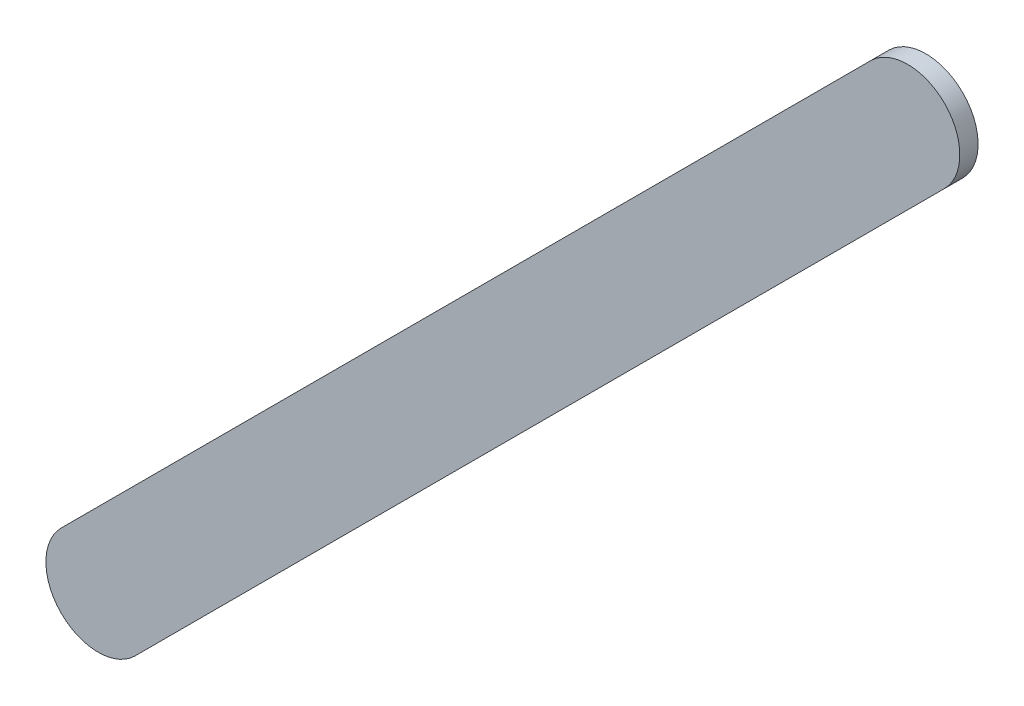
ISO-10303-21;
HEADER;
FILE_DESCRIPTION(('STEP AP214'),'2;1');
FILE_NAME('part.step','',(''),(''),'','','');
FILE_SCHEMA(('AUTOMOTIVE_DESIGN { 1 0 10303 214 1 1 1 1 }'));
ENDSEC;
DATA;
#1=APPLICATION_CONTEXT('core data for automotive mechanical design processes');
#2=APPLICATION_PROTOCOL_DEFINITION('international standard','automotive_design',2000,#1);
#3=PRODUCT_CONTEXT('',#1,'mechanical');
#4=PRODUCT('Part','Part','',(#3));
#5=PRODUCT_RELATED_PRODUCT_CATEGORY('part','',(#4));
#6=PRODUCT_DEFINITION_FORMATION('','',#4);
#7=PRODUCT_DEFINITION_CONTEXT('part definition',#1,'design');
#8=PRODUCT_DEFINITION('design','',#6,#7);
#9=PRODUCT_DEFINITION_SHAPE('','',#8);
#10=(LENGTH_UNIT() NAMED_UNIT(*) SI_UNIT(.MILLI.,.METRE.));
#11=(NAMED_UNIT(*) PLANE_ANGLE_UNIT() SI_UNIT($,.RADIAN.));
#12=(NAMED_UNIT(*) SI_UNIT($,.STERADIAN.) SOLID_ANGLE_UNIT());
#13=UNCERTAINTY_MEASURE_WITH_UNIT(LENGTH_MEASURE(1.E-05),#10,'distance_accuracy_value','');
#14=(GEOMETRIC_REPRESENTATION_CONTEXT(3) GLOBAL_UNCERTAINTY_ASSIGNED_CONTEXT((#13)) GLOBAL_UNIT_ASSIGNED_CONTEXT((#10,
#11,#12)) REPRESENTATION_CONTEXT('',''));
#15=CARTESIAN_POINT('',(0.,0.,0.));
#16=DIRECTION('',(0.,0.,1.));
#17=DIRECTION('',(1.,0.,0.));
#18=AXIS2_PLACEMENT_3D('',#15,#16,#17);
#19=CARTESIAN_POINT('',(91.67071,-133.055024,1.635));
#20=DIRECTION('',(0.,0.,1.));
#21=DIRECTION('',(1.,0.,0.));
#22=AXIS2_PLACEMENT_3D('',#19,#20,#21);
#23=PLANE('',#22);
#24=DIRECTION('',(0.707106781186548,0.707106781186548,0.));
#25=VECTOR('',#24,1.);
#26=CARTESIAN_POINT('',(91.67071,-133.055024,1.635));
#27=LINE('',#26,#25);
#28=CARTESIAN_POINT('',(91.67071,-133.055024,1.635));
#29=VERTEX_POINT('',#28);
#30=CARTESIAN_POINT('',(93.22071,-131.505024,1.635));
#31=VERTEX_POINT('',#30);
#32=EDGE_CURVE('E97',#29,#31,#27,.T.);
#33=ORIENTED_EDGE('',*,*,#32,.T.);
#34=CARTESIAN_POINT('',(93.1499995,-131.4343135,1.635));
#35=DIRECTION('',(0.,0.,1.));
#36=DIRECTION('',(0.707106781186548,-0.707106781186548,0.));
#37=AXIS2_PLACEMENT_3D('',#34,#35,#36);
#38=CIRCLE('',#37,0.09999974810217);
#39=CARTESIAN_POINT('',(93.079289,-131.363603,1.635));
#40=VERTEX_POINT('',#39);
#41=EDGE_CURVE('E76',#31,#40,#38,.T.);
#42=ORIENTED_EDGE('',*,*,#41,.T.);
#43=DIRECTION('',(-0.707106781186548,-0.707106781186548,0.));
#44=VECTOR('',#43,1.);
#45=CARTESIAN_POINT('',(93.079289,-131.363603,1.635));
#46=LINE('',#45,#44);
#47=CARTESIAN_POINT('',(91.529289,-132.913603,1.635));
#48=VERTEX_POINT('',#47);
#49=EDGE_CURVE('E81',#40,#48,#46,.T.);
#50=ORIENTED_EDGE('',*,*,#49,.T.);
#51=CARTESIAN_POINT('',(91.5999995,-132.9843135,1.635));
#52=DIRECTION('',(0.,0.,1.));
#53=DIRECTION('',(-0.707106781186548,0.707106781186548,0.));
#54=AXIS2_PLACEMENT_3D('',#51,#52,#53);
#55=CIRCLE('',#54,0.09999974810219);
#56=EDGE_CURVE('E11',#48,#29,#55,.T.);
#57=ORIENTED_EDGE('',*,*,#56,.T.);
#58=EDGE_LOOP('',(#33,#42,#50,#57));
#59=FACE_BOUND('',#58,.T.);
#60=ADVANCED_FACE('F17',(#59),#23,.T.);
#61=CARTESIAN_POINT('',(91.67071,-133.055024,1.6));
#62=DIRECTION('',(0.,0.,1.));
#63=DIRECTION('',(1.,0.,0.));
#64=AXIS2_PLACEMENT_3D('',#61,#62,#63);
#65=PLANE('',#64);
#66=CARTESIAN_POINT('',(91.5999995,-132.9843135,1.6));
#67=DIRECTION('',(0.,0.,1.));
#68=DIRECTION('',(-0.707106781186548,0.707106781186548,0.));
#69=AXIS2_PLACEMENT_3D('',#66,#67,#68);
#70=CIRCLE('',#69,0.09999974810219);
#71=CARTESIAN_POINT('',(91.529289,-132.913603,1.6));
#72=VERTEX_POINT('',#71);
#73=CARTESIAN_POINT('',(91.67071,-133.055024,1.6));
#74=VERTEX_POINT('',#73);
#75=EDGE_CURVE('E20',#72,#74,#70,.T.);
#76=ORIENTED_EDGE('',*,*,#75,.F.);
#77=DIRECTION('',(-0.707106781186548,-0.707106781186548,0.));
#78=VECTOR('',#77,1.);
#79=CARTESIAN_POINT('',(93.079289,-131.363603,1.6));
#80=LINE('',#79,#78);
#81=CARTESIAN_POINT('',(93.079289,-131.363603,1.6));
#82=VERTEX_POINT('',#81);
#83=EDGE_CURVE('E65',#82,#72,#80,.T.);
#84=ORIENTED_EDGE('',*,*,#83,.F.);
#85=CARTESIAN_POINT('',(93.1499995,-131.4343135,1.6));
#86=DIRECTION('',(0.,0.,1.));
#87=DIRECTION('',(0.707106781186548,-0.707106781186548,0.));
#88=AXIS2_PLACEMENT_3D('',#85,#86,#87);
#89=CIRCLE('',#88,0.09999974810217);
#90=CARTESIAN_POINT('',(93.22071,-131.505024,1.6));
#91=VERTEX_POINT('',#90);
#92=EDGE_CURVE('E70',#91,#82,#89,.T.);
#93=ORIENTED_EDGE('',*,*,#92,.F.);
#94=DIRECTION('',(0.707106781186548,0.707106781186548,0.));
#95=VECTOR('',#94,1.);
#96=CARTESIAN_POINT('',(91.67071,-133.055024,1.6));
#97=LINE('',#96,#95);
#98=EDGE_CURVE('E105',#74,#91,#97,.T.);
#99=ORIENTED_EDGE('',*,*,#98,.F.);
#100=EDGE_LOOP('',(#76,#84,#93,#99));
#101=FACE_BOUND('',#100,.T.);
#102=ADVANCED_FACE('F67',(#101),#65,.F.);
#103=CARTESIAN_POINT('',(91.5999995,-132.9843135,1.6));
#104=DIRECTION('',(0.,0.,-1.));
#105=DIRECTION('',(-0.707106781186548,0.707106781186548,0.));
#106=AXIS2_PLACEMENT_3D('',#103,#104,#105);
#107=CYLINDRICAL_SURFACE('',#106,0.09999974810219);
#108=ORIENTED_EDGE('',*,*,#75,.T.);
#109=DIRECTION('',(0.,0.,1.));
#110=VECTOR('',#109,1.);
#111=CARTESIAN_POINT('',(91.67071,-133.055024,1.6));
#112=LINE('',#111,#110);
#113=EDGE_CURVE('E91',#74,#29,#112,.T.);
#114=ORIENTED_EDGE('',*,*,#113,.T.);
#115=ORIENTED_EDGE('',*,*,#56,.F.);
#116=DIRECTION('',(0.,0.,1.));
#117=VECTOR('',#116,1.);
#118=CARTESIAN_POINT('',(91.529289,-132.913603,1.6));
#119=LINE('',#118,#117);
#120=EDGE_CURVE('E75',#72,#48,#119,.T.);
#121=ORIENTED_EDGE('',*,*,#120,.F.);
#122=EDGE_LOOP('',(#108,#114,#115,#121));
#123=FACE_BOUND('',#122,.T.);
#124=ADVANCED_FACE('F118',(#123),#107,.T.);
#125=CARTESIAN_POINT('',(93.079289,-131.363603,1.6));
#126=DIRECTION('',(0.707106781186548,-0.707106781186548,0.));
#127=DIRECTION('',(0.,0.,-1.));
#128=AXIS2_PLACEMENT_3D('',#125,#126,#127);
#129=PLANE('',#128);
#130=ORIENTED_EDGE('',*,*,#83,.T.);
#131=ORIENTED_EDGE('',*,*,#120,.T.);
#132=ORIENTED_EDGE('',*,*,#49,.F.);
#133=DIRECTION('',(0.,0.,1.));
#134=VECTOR('',#133,1.);
#135=CARTESIAN_POINT('',(93.079289,-131.363603,1.6));
#136=LINE('',#135,#134);
#137=EDGE_CURVE('E79',#82,#40,#136,.T.);
#138=ORIENTED_EDGE('',*,*,#137,.F.);
#139=EDGE_LOOP('',(#130,#131,#132,#138));
#140=FACE_BOUND('',#139,.T.);
#141=ADVANCED_FACE('F80',(#140),#129,.F.);
#142=CARTESIAN_POINT('',(93.1499995,-131.4343135,1.6));
#143=DIRECTION('',(0.,0.,-1.));
#144=DIRECTION('',(0.707106781186548,-0.707106781186548,0.));
#145=AXIS2_PLACEMENT_3D('',#142,#143,#144);
#146=CYLINDRICAL_SURFACE('',#145,0.09999974810217);
#147=ORIENTED_EDGE('',*,*,#92,.T.);
#148=ORIENTED_EDGE('',*,*,#137,.T.);
#149=ORIENTED_EDGE('',*,*,#41,.F.);
#150=DIRECTION('',(0.,0.,1.));
#151=VECTOR('',#150,1.);
#152=CARTESIAN_POINT('',(93.22071,-131.505024,1.6));
#153=LINE('',#152,#151);
#154=EDGE_CURVE('E88',#91,#31,#153,.T.);
#155=ORIENTED_EDGE('',*,*,#154,.F.);
#156=EDGE_LOOP('',(#147,#148,#149,#155));
#157=FACE_BOUND('',#156,.T.);
#158=ADVANCED_FACE('F86',(#157),#146,.T.);
#159=CARTESIAN_POINT('',(91.67071,-133.055024,1.6));
#160=DIRECTION('',(-0.707106781186548,0.707106781186548,0.));
#161=DIRECTION('',(0.,0.,1.));
#162=AXIS2_PLACEMENT_3D('',#159,#160,#161);
#163=PLANE('',#162);
#164=ORIENTED_EDGE('',*,*,#98,.T.);
#165=ORIENTED_EDGE('',*,*,#154,.T.);
#166=ORIENTED_EDGE('',*,*,#32,.F.);
#167=ORIENTED_EDGE('',*,*,#113,.F.);
#168=EDGE_LOOP('',(#164,#165,#166,#167));
#169=FACE_BOUND('',#168,.T.);
#170=ADVANCED_FACE('F121',(#169),#163,.F.);
#171=CLOSED_SHELL('',(#60,#102,#124,#141,#158,#170));
#172=MANIFOLD_SOLID_BREP('B1',#171);
#173=ADVANCED_BREP_SHAPE_REPRESENTATION('',(#18,#172),#14);
#174=SHAPE_DEFINITION_REPRESENTATION(#9,#173);
ENDSEC;
END-ISO-10303-21;
